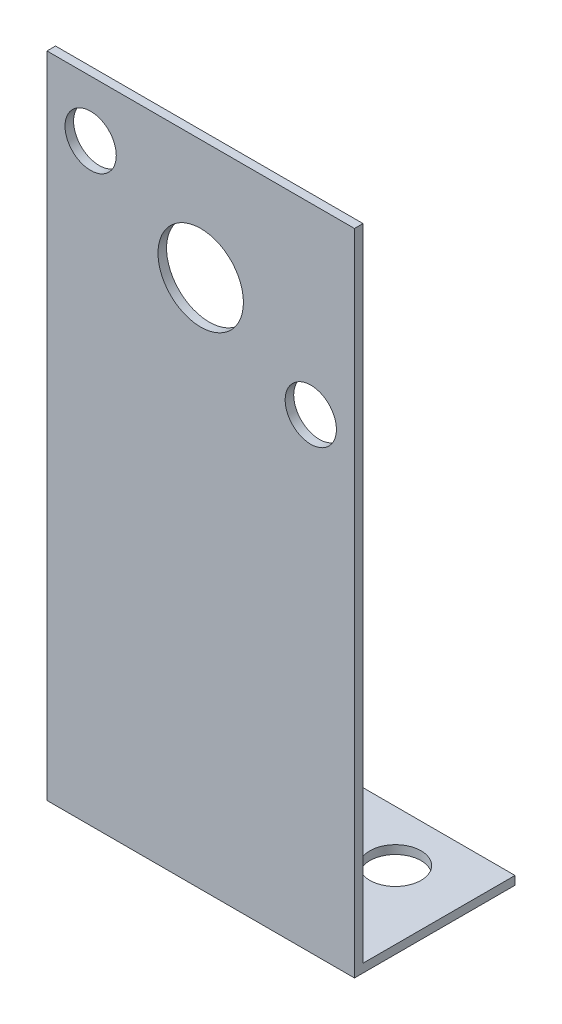
ISO-10303-21;
HEADER;
FILE_DESCRIPTION(('STEP AP214'),'2;1');
FILE_NAME('part.step','',(''),(''),'','','');
FILE_SCHEMA(('AUTOMOTIVE_DESIGN { 1 0 10303 214 1 1 1 1 }'));
ENDSEC;
DATA;
#1=APPLICATION_CONTEXT('core data for automotive mechanical design processes');
#2=APPLICATION_PROTOCOL_DEFINITION('international standard','automotive_design',2000,#1);
#3=PRODUCT_CONTEXT('',#1,'mechanical');
#4=PRODUCT('Part','Part','',(#3));
#5=PRODUCT_RELATED_PRODUCT_CATEGORY('part','',(#4));
#6=PRODUCT_DEFINITION_FORMATION('','',#4);
#7=PRODUCT_DEFINITION_CONTEXT('part definition',#1,'design');
#8=PRODUCT_DEFINITION('design','',#6,#7);
#9=PRODUCT_DEFINITION_SHAPE('','',#8);
#10=(LENGTH_UNIT() NAMED_UNIT(*) SI_UNIT(.MILLI.,.METRE.));
#11=(NAMED_UNIT(*) PLANE_ANGLE_UNIT() SI_UNIT($,.RADIAN.));
#12=(NAMED_UNIT(*) SI_UNIT($,.STERADIAN.) SOLID_ANGLE_UNIT());
#13=UNCERTAINTY_MEASURE_WITH_UNIT(LENGTH_MEASURE(1.E-05),#10,'distance_accuracy_value','');
#14=(GEOMETRIC_REPRESENTATION_CONTEXT(3) GLOBAL_UNCERTAINTY_ASSIGNED_CONTEXT((#13)) GLOBAL_UNIT_ASSIGNED_CONTEXT((#10,
#11,#12)) REPRESENTATION_CONTEXT('',''));
#15=CARTESIAN_POINT('',(0.,0.,0.));
#16=DIRECTION('',(0.,0.,1.));
#17=DIRECTION('',(1.,0.,0.));
#18=AXIS2_PLACEMENT_3D('',#15,#16,#17);
#19=CARTESIAN_POINT('',(-8.99999999999999,-31.,0.));
#20=DIRECTION('',(0.,0.,1.));
#21=DIRECTION('',(1.,0.,0.));
#22=AXIS2_PLACEMENT_3D('',#19,#20,#21);
#23=PLANE('',#22);
#24=CARTESIAN_POINT('',(-6.44322900415622,3.72,0.));
#25=DIRECTION('',(0.,0.,-1.));
#26=DIRECTION('',(-1.,0.,0.));
#27=AXIS2_PLACEMENT_3D('',#24,#25,#26);
#28=CIRCLE('',#27,1.5);
#29=CARTESIAN_POINT('',(-7.94322900415622,3.72,0.));
#30=VERTEX_POINT('',#29);
#31=EDGE_CURVE('E206',#30,#30,#28,.T.);
#32=ORIENTED_EDGE('',*,*,#31,.F.);
#33=EDGE_LOOP('',(#32));
#34=FACE_BOUND('',#33,.T.);
#35=CARTESIAN_POINT('',(6.44322900415622,-3.72,0.));
#36=DIRECTION('',(0.,0.,-1.));
#37=DIRECTION('',(-1.,0.,0.));
#38=AXIS2_PLACEMENT_3D('',#35,#36,#37);
#39=CIRCLE('',#38,1.5);
#40=CARTESIAN_POINT('',(4.94322900415622,-3.72,0.));
#41=VERTEX_POINT('',#40);
#42=EDGE_CURVE('E200',#41,#41,#39,.T.);
#43=ORIENTED_EDGE('',*,*,#42,.F.);
#44=EDGE_LOOP('',(#43));
#45=FACE_BOUND('',#44,.T.);
#46=CARTESIAN_POINT('',(0.,0.,0.));
#47=DIRECTION('',(0.,0.,1.));
#48=DIRECTION('',(1.,0.,0.));
#49=AXIS2_PLACEMENT_3D('',#46,#47,#48);
#50=CIRCLE('',#49,2.5);
#51=CARTESIAN_POINT('',(2.5,0.,0.));
#52=VERTEX_POINT('',#51);
#53=EDGE_CURVE('E118',#52,#52,#50,.T.);
#54=ORIENTED_EDGE('',*,*,#53,.T.);
#55=EDGE_LOOP('',(#54));
#56=FACE_BOUND('',#55,.T.);
#57=DIRECTION('',(1.,0.,0.));
#58=VECTOR('',#57,1.);
#59=CARTESIAN_POINT('',(-8.99999999999999,-30.5,0.));
#60=LINE('',#59,#58);
#61=CARTESIAN_POINT('',(-8.99999999999999,-30.5,0.));
#62=VERTEX_POINT('',#61);
#63=CARTESIAN_POINT('',(9.,-30.5,0.));
#64=VERTEX_POINT('',#63);
#65=EDGE_CURVE('E49',#62,#64,#60,.T.);
#66=ORIENTED_EDGE('',*,*,#65,.F.);
#67=DIRECTION('',(0.,-1.,0.));
#68=VECTOR('',#67,1.);
#69=CARTESIAN_POINT('',(-9.,7.,0.));
#70=LINE('',#69,#68);
#71=CARTESIAN_POINT('',(-9.,7.,0.));
#72=VERTEX_POINT('',#71);
#73=EDGE_CURVE('E117',#72,#62,#70,.T.);
#74=ORIENTED_EDGE('',*,*,#73,.F.);
#75=DIRECTION('',(-1.,0.,0.));
#76=VECTOR('',#75,1.);
#77=CARTESIAN_POINT('',(-9.,7.,0.));
#78=LINE('',#77,#76);
#79=CARTESIAN_POINT('',(9.,7.,0.));
#80=VERTEX_POINT('',#79);
#81=EDGE_CURVE('E73',#80,#72,#78,.T.);
#82=ORIENTED_EDGE('',*,*,#81,.F.);
#83=DIRECTION('',(0.,1.,0.));
#84=VECTOR('',#83,1.);
#85=CARTESIAN_POINT('',(9.,7.,0.));
#86=LINE('',#85,#84);
#87=EDGE_CURVE('E129',#64,#80,#86,.T.);
#88=ORIENTED_EDGE('',*,*,#87,.F.);
#89=EDGE_LOOP('',(#66,#74,#82,#88));
#90=FACE_BOUND('',#89,.T.);
#91=ADVANCED_FACE('F32',(#34,#45,#56,#90),#23,.F.);
#92=CARTESIAN_POINT('',(-8.99999999999999,-31.,0.5));
#93=DIRECTION('',(0.,0.,1.));
#94=DIRECTION('',(1.,0.,0.));
#95=AXIS2_PLACEMENT_3D('',#92,#93,#94);
#96=PLANE('',#95);
#97=CARTESIAN_POINT('',(-6.44322900415622,3.72,0.5));
#98=DIRECTION('',(0.,0.,1.));
#99=DIRECTION('',(1.,0.,0.));
#100=AXIS2_PLACEMENT_3D('',#97,#98,#99);
#101=CIRCLE('',#100,1.5);
#102=CARTESIAN_POINT('',(-4.94322900415622,3.72,0.5));
#103=VERTEX_POINT('',#102);
#104=EDGE_CURVE('E203',#103,#103,#101,.F.);
#105=ORIENTED_EDGE('',*,*,#104,.T.);
#106=EDGE_LOOP('',(#105));
#107=FACE_BOUND('',#106,.T.);
#108=CARTESIAN_POINT('',(6.44322900415622,-3.72,0.5));
#109=DIRECTION('',(0.,0.,1.));
#110=DIRECTION('',(1.,0.,0.));
#111=AXIS2_PLACEMENT_3D('',#108,#109,#110);
#112=CIRCLE('',#111,1.5);
#113=CARTESIAN_POINT('',(7.94322900415622,-3.72,0.5));
#114=VERTEX_POINT('',#113);
#115=EDGE_CURVE('E197',#114,#114,#112,.F.);
#116=ORIENTED_EDGE('',*,*,#115,.T.);
#117=EDGE_LOOP('',(#116));
#118=FACE_BOUND('',#117,.T.);
#119=DIRECTION('',(0.,-1.,0.));
#120=VECTOR('',#119,1.);
#121=CARTESIAN_POINT('',(-9.,7.,0.5));
#122=LINE('',#121,#120);
#123=CARTESIAN_POINT('',(-9.,7.,0.5));
#124=VERTEX_POINT('',#123);
#125=CARTESIAN_POINT('',(-8.99999999999999,-31.,0.5));
#126=VERTEX_POINT('',#125);
#127=EDGE_CURVE('E138',#124,#126,#122,.T.);
#128=ORIENTED_EDGE('',*,*,#127,.T.);
#129=DIRECTION('',(1.,0.,0.));
#130=VECTOR('',#129,1.);
#131=CARTESIAN_POINT('',(-8.99999999999999,-31.,0.5));
#132=LINE('',#131,#130);
#133=CARTESIAN_POINT('',(9.,-31.,0.5));
#134=VERTEX_POINT('',#133);
#135=EDGE_CURVE('E80',#126,#134,#132,.T.);
#136=ORIENTED_EDGE('',*,*,#135,.T.);
#137=DIRECTION('',(0.,1.,0.));
#138=VECTOR('',#137,1.);
#139=CARTESIAN_POINT('',(9.,7.,0.5));
#140=LINE('',#139,#138);
#141=CARTESIAN_POINT('',(9.,7.,0.5));
#142=VERTEX_POINT('',#141);
#143=EDGE_CURVE('E141',#134,#142,#140,.T.);
#144=ORIENTED_EDGE('',*,*,#143,.T.);
#145=DIRECTION('',(-1.,0.,0.));
#146=VECTOR('',#145,1.);
#147=CARTESIAN_POINT('',(-9.,7.,0.5));
#148=LINE('',#147,#146);
#149=EDGE_CURVE('E58',#142,#124,#148,.T.);
#150=ORIENTED_EDGE('',*,*,#149,.T.);
#151=EDGE_LOOP('',(#128,#136,#144,#150));
#152=FACE_BOUND('',#151,.T.);
#153=CARTESIAN_POINT('',(0.,0.,0.5));
#154=DIRECTION('',(0.,0.,1.));
#155=DIRECTION('',(1.,0.,0.));
#156=AXIS2_PLACEMENT_3D('',#153,#154,#155);
#157=CIRCLE('',#156,2.5);
#158=CARTESIAN_POINT('',(2.5,0.,0.5));
#159=VERTEX_POINT('',#158);
#160=EDGE_CURVE('E120',#159,#159,#157,.T.);
#161=ORIENTED_EDGE('',*,*,#160,.F.);
#162=EDGE_LOOP('',(#161));
#163=FACE_BOUND('',#162,.T.);
#164=ADVANCED_FACE('F158',(#107,#118,#152,#163),#96,.T.);
#165=CARTESIAN_POINT('',(-9.,7.,0.5));
#166=DIRECTION('',(1.,0.,0.));
#167=DIRECTION('',(0.,1.,0.));
#168=AXIS2_PLACEMENT_3D('',#165,#166,#167);
#169=PLANE('',#168);
#170=ORIENTED_EDGE('',*,*,#73,.T.);
#171=DIRECTION('',(0.,0.,1.));
#172=VECTOR('',#171,1.);
#173=CARTESIAN_POINT('',(-8.99999999999999,-30.5,-8.9));
#174=LINE('',#173,#172);
#175=CARTESIAN_POINT('',(-8.99999999999999,-30.5,-8.9));
#176=VERTEX_POINT('',#175);
#177=EDGE_CURVE('E100',#176,#62,#174,.T.);
#178=ORIENTED_EDGE('',*,*,#177,.F.);
#179=DIRECTION('',(0.,1.,0.));
#180=VECTOR('',#179,1.);
#181=CARTESIAN_POINT('',(-8.99999999999999,-31.,-8.9));
#182=LINE('',#181,#180);
#183=CARTESIAN_POINT('',(-8.99999999999999,-31.,-8.9));
#184=VERTEX_POINT('',#183);
#185=EDGE_CURVE('E107',#184,#176,#182,.T.);
#186=ORIENTED_EDGE('',*,*,#185,.F.);
#187=DIRECTION('',(0.,0.,-1.));
#188=VECTOR('',#187,1.);
#189=CARTESIAN_POINT('',(-8.99999999999999,-31.,0.5));
#190=LINE('',#189,#188);
#191=EDGE_CURVE('E11',#126,#184,#190,.T.);
#192=ORIENTED_EDGE('',*,*,#191,.F.);
#193=ORIENTED_EDGE('',*,*,#127,.F.);
#194=DIRECTION('',(0.,0.,-1.));
#195=VECTOR('',#194,1.);
#196=CARTESIAN_POINT('',(-9.,7.,0.5));
#197=LINE('',#196,#195);
#198=EDGE_CURVE('E144',#124,#72,#197,.T.);
#199=ORIENTED_EDGE('',*,*,#198,.T.);
#200=EDGE_LOOP('',(#170,#178,#186,#192,#193,#199));
#201=FACE_BOUND('',#200,.T.);
#202=ADVANCED_FACE('F34',(#201),#169,.F.);
#203=CARTESIAN_POINT('',(-8.99999999999999,-31.,0.5));
#204=DIRECTION('',(0.,1.,0.));
#205=DIRECTION('',(0.,0.,1.));
#206=AXIS2_PLACEMENT_3D('',#203,#204,#205);
#207=PLANE('',#206);
#208=CARTESIAN_POINT('',(5.,-31.,-5.9));
#209=DIRECTION('',(0.,1.,0.));
#210=DIRECTION('',(0.,0.,1.));
#211=AXIS2_PLACEMENT_3D('',#208,#209,#210);
#212=CIRCLE('',#211,1.5);
#213=CARTESIAN_POINT('',(5.,-31.,-4.4));
#214=VERTEX_POINT('',#213);
#215=EDGE_CURVE('E183',#214,#214,#212,.F.);
#216=ORIENTED_EDGE('',*,*,#215,.F.);
#217=EDGE_LOOP('',(#216));
#218=FACE_BOUND('',#217,.T.);
#219=CARTESIAN_POINT('',(-5.,-31.,-5.9));
#220=DIRECTION('',(0.,1.,0.));
#221=DIRECTION('',(0.,0.,1.));
#222=AXIS2_PLACEMENT_3D('',#219,#220,#221);
#223=CIRCLE('',#222,1.5);
#224=CARTESIAN_POINT('',(-5.,-31.,-4.4));
#225=VERTEX_POINT('',#224);
#226=EDGE_CURVE('E128',#225,#225,#223,.F.);
#227=ORIENTED_EDGE('',*,*,#226,.F.);
#228=EDGE_LOOP('',(#227));
#229=FACE_BOUND('',#228,.T.);
#230=ORIENTED_EDGE('',*,*,#191,.T.);
#231=DIRECTION('',(-1.,0.,0.));
#232=VECTOR('',#231,1.);
#233=CARTESIAN_POINT('',(-8.99999999999999,-31.,-8.9));
#234=LINE('',#233,#232);
#235=CARTESIAN_POINT('',(9.,-31.,-8.9));
#236=VERTEX_POINT('',#235);
#237=EDGE_CURVE('E113',#236,#184,#234,.T.);
#238=ORIENTED_EDGE('',*,*,#237,.F.);
#239=DIRECTION('',(0.,0.,-1.));
#240=VECTOR('',#239,1.);
#241=CARTESIAN_POINT('',(9.,-31.,0.5));
#242=LINE('',#241,#240);
#243=EDGE_CURVE('E41',#134,#236,#242,.T.);
#244=ORIENTED_EDGE('',*,*,#243,.F.);
#245=ORIENTED_EDGE('',*,*,#135,.F.);
#246=EDGE_LOOP('',(#230,#238,#244,#245));
#247=FACE_BOUND('',#246,.T.);
#248=ADVANCED_FACE('F174',(#218,#229,#247),#207,.F.);
#249=CARTESIAN_POINT('',(9.,7.,0.5));
#250=DIRECTION('',(-1.,0.,0.));
#251=DIRECTION('',(0.,-1.,0.));
#252=AXIS2_PLACEMENT_3D('',#249,#250,#251);
#253=PLANE('',#252);
#254=ORIENTED_EDGE('',*,*,#243,.T.);
#255=DIRECTION('',(0.,-1.,0.));
#256=VECTOR('',#255,1.);
#257=CARTESIAN_POINT('',(9.,-31.,-8.9));
#258=LINE('',#257,#256);
#259=CARTESIAN_POINT('',(9.,-30.5,-8.9));
#260=VERTEX_POINT('',#259);
#261=EDGE_CURVE('E106',#260,#236,#258,.T.);
#262=ORIENTED_EDGE('',*,*,#261,.F.);
#263=DIRECTION('',(0.,0.,1.));
#264=VECTOR('',#263,1.);
#265=CARTESIAN_POINT('',(9.,-30.5,-8.9));
#266=LINE('',#265,#264);
#267=EDGE_CURVE('E102',#260,#64,#266,.T.);
#268=ORIENTED_EDGE('',*,*,#267,.T.);
#269=ORIENTED_EDGE('',*,*,#87,.T.);
#270=DIRECTION('',(0.,0.,-1.));
#271=VECTOR('',#270,1.);
#272=CARTESIAN_POINT('',(9.,7.,0.5));
#273=LINE('',#272,#271);
#274=EDGE_CURVE('E150',#142,#80,#273,.T.);
#275=ORIENTED_EDGE('',*,*,#274,.F.);
#276=ORIENTED_EDGE('',*,*,#143,.F.);
#277=EDGE_LOOP('',(#254,#262,#268,#269,#275,#276));
#278=FACE_BOUND('',#277,.T.);
#279=ADVANCED_FACE('F154',(#278),#253,.F.);
#280=CARTESIAN_POINT('',(-9.,7.,0.5));
#281=DIRECTION('',(0.,-1.,0.));
#282=DIRECTION('',(0.,0.,-1.));
#283=AXIS2_PLACEMENT_3D('',#280,#281,#282);
#284=PLANE('',#283);
#285=ORIENTED_EDGE('',*,*,#81,.T.);
#286=ORIENTED_EDGE('',*,*,#198,.F.);
#287=ORIENTED_EDGE('',*,*,#149,.F.);
#288=ORIENTED_EDGE('',*,*,#274,.T.);
#289=EDGE_LOOP('',(#285,#286,#287,#288));
#290=FACE_BOUND('',#289,.T.);
#291=ADVANCED_FACE('F156',(#290),#284,.F.);
#292=CARTESIAN_POINT('',(0.,0.,0.5));
#293=DIRECTION('',(0.,0.,-1.));
#294=DIRECTION('',(-1.,0.,0.));
#295=AXIS2_PLACEMENT_3D('',#292,#293,#294);
#296=CYLINDRICAL_SURFACE('',#295,2.5);
#297=ORIENTED_EDGE('',*,*,#160,.T.);
#298=EDGE_LOOP('',(#297));
#299=FACE_BOUND('',#298,.T.);
#300=ORIENTED_EDGE('',*,*,#53,.F.);
#301=EDGE_LOOP('',(#300));
#302=FACE_BOUND('',#301,.T.);
#303=ADVANCED_FACE('F172',(#299,#302),#296,.F.);
#304=CARTESIAN_POINT('',(-8.99999999999999,-30.5,-8.9));
#305=DIRECTION('',(0.,-1.,0.));
#306=DIRECTION('',(1.,0.,0.));
#307=AXIS2_PLACEMENT_3D('',#304,#305,#306);
#308=PLANE('',#307);
#309=CARTESIAN_POINT('',(5.,-30.5,-5.9));
#310=DIRECTION('',(0.,1.,0.));
#311=DIRECTION('',(-1.,0.,0.));
#312=AXIS2_PLACEMENT_3D('',#309,#310,#311);
#313=CIRCLE('',#312,1.5);
#314=CARTESIAN_POINT('',(3.5,-30.5,-5.9));
#315=VERTEX_POINT('',#314);
#316=EDGE_CURVE('E194',#315,#315,#313,.T.);
#317=ORIENTED_EDGE('',*,*,#316,.F.);
#318=EDGE_LOOP('',(#317));
#319=FACE_BOUND('',#318,.T.);
#320=CARTESIAN_POINT('',(-5.,-30.5,-5.9));
#321=DIRECTION('',(0.,1.,0.));
#322=DIRECTION('',(-1.,0.,0.));
#323=AXIS2_PLACEMENT_3D('',#320,#321,#322);
#324=CIRCLE('',#323,1.5);
#325=CARTESIAN_POINT('',(-6.5,-30.5,-5.9));
#326=VERTEX_POINT('',#325);
#327=EDGE_CURVE('E190',#326,#326,#324,.T.);
#328=ORIENTED_EDGE('',*,*,#327,.F.);
#329=EDGE_LOOP('',(#328));
#330=FACE_BOUND('',#329,.T.);
#331=ORIENTED_EDGE('',*,*,#65,.T.);
#332=ORIENTED_EDGE('',*,*,#267,.F.);
#333=DIRECTION('',(1.,0.,0.));
#334=VECTOR('',#333,1.);
#335=CARTESIAN_POINT('',(-8.99999999999999,-30.5,-8.9));
#336=LINE('',#335,#334);
#337=EDGE_CURVE('E96',#176,#260,#336,.T.);
#338=ORIENTED_EDGE('',*,*,#337,.F.);
#339=ORIENTED_EDGE('',*,*,#177,.T.);
#340=EDGE_LOOP('',(#331,#332,#338,#339));
#341=FACE_BOUND('',#340,.T.);
#342=ADVANCED_FACE('F98',(#319,#330,#341),#308,.F.);
#343=CARTESIAN_POINT('',(-8.99999999999999,-30.5,-8.9));
#344=DIRECTION('',(0.,0.,-1.));
#345=DIRECTION('',(-1.,0.,0.));
#346=AXIS2_PLACEMENT_3D('',#343,#344,#345);
#347=PLANE('',#346);
#348=ORIENTED_EDGE('',*,*,#185,.T.);
#349=ORIENTED_EDGE('',*,*,#337,.T.);
#350=ORIENTED_EDGE('',*,*,#261,.T.);
#351=ORIENTED_EDGE('',*,*,#237,.T.);
#352=EDGE_LOOP('',(#348,#349,#350,#351));
#353=FACE_BOUND('',#352,.T.);
#354=ADVANCED_FACE('F111',(#353),#347,.T.);
#355=CARTESIAN_POINT('',(-5.,-35.2426406871193,-5.9));
#356=DIRECTION('',(0.,1.,0.));
#357=DIRECTION('',(-1.,0.,0.));
#358=AXIS2_PLACEMENT_3D('',#355,#356,#357);
#359=CYLINDRICAL_SURFACE('',#358,1.5);
#360=ORIENTED_EDGE('',*,*,#226,.T.);
#361=EDGE_LOOP('',(#360));
#362=FACE_BOUND('',#361,.T.);
#363=ORIENTED_EDGE('',*,*,#327,.T.);
#364=EDGE_LOOP('',(#363));
#365=FACE_BOUND('',#364,.T.);
#366=ADVANCED_FACE('F225',(#362,#365),#359,.F.);
#367=CARTESIAN_POINT('',(5.,-35.2426406871193,-5.9));
#368=DIRECTION('',(0.,1.,0.));
#369=DIRECTION('',(-1.,0.,0.));
#370=AXIS2_PLACEMENT_3D('',#367,#368,#369);
#371=CYLINDRICAL_SURFACE('',#370,1.5);
#372=ORIENTED_EDGE('',*,*,#215,.T.);
#373=EDGE_LOOP('',(#372));
#374=FACE_BOUND('',#373,.T.);
#375=ORIENTED_EDGE('',*,*,#316,.T.);
#376=EDGE_LOOP('',(#375));
#377=FACE_BOUND('',#376,.T.);
#378=ADVANCED_FACE('F219',(#374,#377),#371,.F.);
#379=CARTESIAN_POINT('',(6.44322900415622,-3.72,4.74264068711928));
#380=DIRECTION('',(0.,0.,-1.));
#381=DIRECTION('',(-1.,0.,0.));
#382=AXIS2_PLACEMENT_3D('',#379,#380,#381);
#383=CYLINDRICAL_SURFACE('',#382,1.5);
#384=ORIENTED_EDGE('',*,*,#42,.T.);
#385=EDGE_LOOP('',(#384));
#386=FACE_BOUND('',#385,.T.);
#387=ORIENTED_EDGE('',*,*,#115,.F.);
#388=EDGE_LOOP('',(#387));
#389=FACE_BOUND('',#388,.T.);
#390=ADVANCED_FACE('F212',(#386,#389),#383,.F.);
#391=CARTESIAN_POINT('',(-6.44322900415622,3.72,4.74264068711928));
#392=DIRECTION('',(0.,0.,-1.));
#393=DIRECTION('',(-1.,0.,0.));
#394=AXIS2_PLACEMENT_3D('',#391,#392,#393);
#395=CYLINDRICAL_SURFACE('',#394,1.5);
#396=ORIENTED_EDGE('',*,*,#31,.T.);
#397=EDGE_LOOP('',(#396));
#398=FACE_BOUND('',#397,.T.);
#399=ORIENTED_EDGE('',*,*,#104,.F.);
#400=EDGE_LOOP('',(#399));
#401=FACE_BOUND('',#400,.T.);
#402=ADVANCED_FACE('F209',(#398,#401),#395,.F.);
#403=CLOSED_SHELL('',(#91,#164,#202,#248,#279,#291,#303,#342,#354,#366,#378,#390,#402));
#404=MANIFOLD_SOLID_BREP('B2',#403);
#405=ADVANCED_BREP_SHAPE_REPRESENTATION('',(#18,#404),#14);
#406=SHAPE_DEFINITION_REPRESENTATION(#9,#405);
ENDSEC;
END-ISO-10303-21;
